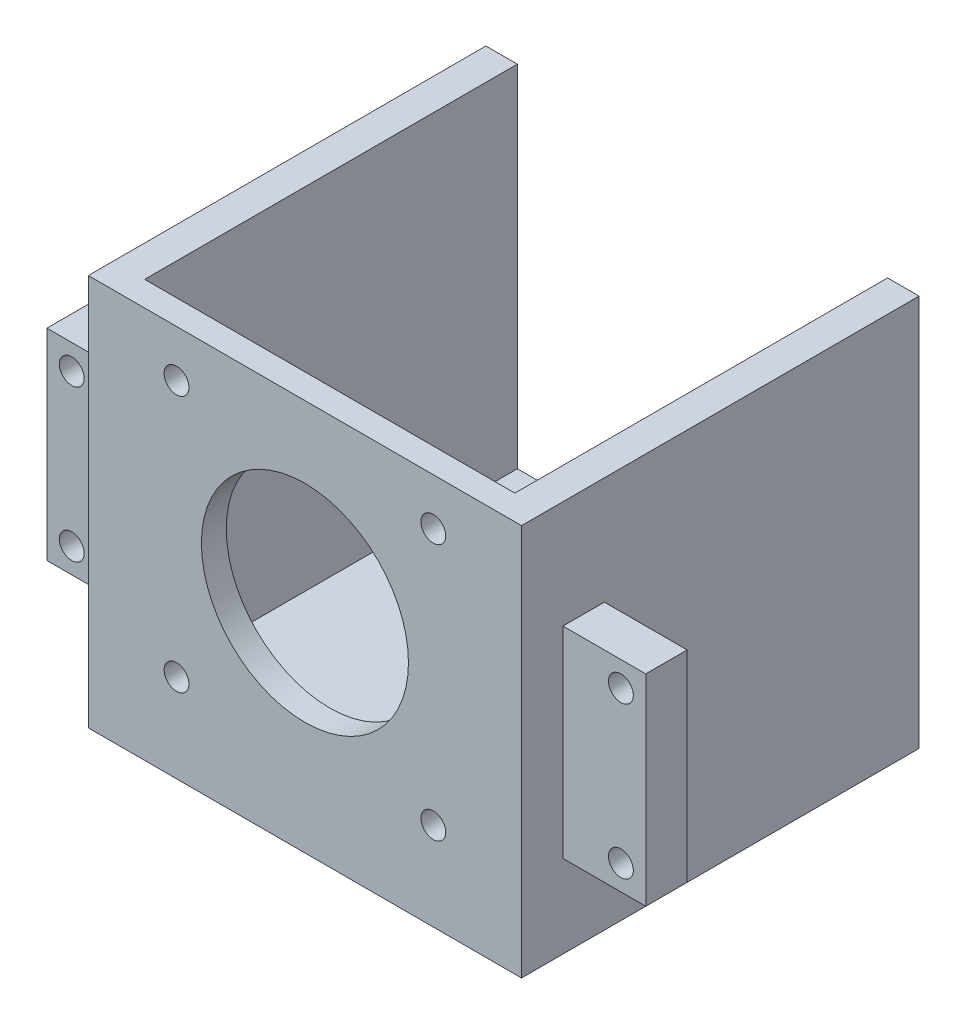
ISO-10303-21;
HEADER;
FILE_DESCRIPTION(('STEP AP214'),'2;1');
FILE_NAME('part.step','',(''),(''),'','','');
FILE_SCHEMA(('AUTOMOTIVE_DESIGN { 1 0 10303 214 1 1 1 1 }'));
ENDSEC;
DATA;
#1=APPLICATION_CONTEXT('core data for automotive mechanical design processes');
#2=APPLICATION_PROTOCOL_DEFINITION('international standard','automotive_design',2000,#1);
#3=PRODUCT_CONTEXT('',#1,'mechanical');
#4=PRODUCT('Part','Part','',(#3));
#5=PRODUCT_RELATED_PRODUCT_CATEGORY('part','',(#4));
#6=PRODUCT_DEFINITION_FORMATION('','',#4);
#7=PRODUCT_DEFINITION_CONTEXT('part definition',#1,'design');
#8=PRODUCT_DEFINITION('design','',#6,#7);
#9=PRODUCT_DEFINITION_SHAPE('','',#8);
#10=(LENGTH_UNIT() NAMED_UNIT(*) SI_UNIT(.MILLI.,.METRE.));
#11=(NAMED_UNIT(*) PLANE_ANGLE_UNIT() SI_UNIT($,.RADIAN.));
#12=(NAMED_UNIT(*) SI_UNIT($,.STERADIAN.) SOLID_ANGLE_UNIT());
#13=UNCERTAINTY_MEASURE_WITH_UNIT(LENGTH_MEASURE(1.E-05),#10,'distance_accuracy_value','');
#14=(GEOMETRIC_REPRESENTATION_CONTEXT(3) GLOBAL_UNCERTAINTY_ASSIGNED_CONTEXT((#13)) GLOBAL_UNIT_ASSIGNED_CONTEXT((#10,
#11,#12)) REPRESENTATION_CONTEXT('',''));
#15=CARTESIAN_POINT('',(0.,0.,0.));
#16=DIRECTION('',(0.,0.,1.));
#17=DIRECTION('',(1.,0.,0.));
#18=AXIS2_PLACEMENT_3D('',#15,#16,#17);
#19=CARTESIAN_POINT('',(-26.15,0.,-45.));
#20=DIRECTION('',(1.,0.,0.));
#21=DIRECTION('',(0.,0.,-1.));
#22=AXIS2_PLACEMENT_3D('',#19,#20,#21);
#23=PLANE('',#22);
#24=DIRECTION('',(0.,0.,1.));
#25=VECTOR('',#24,1.);
#26=CARTESIAN_POINT('',(-26.15,-16.15,-12.));
#27=LINE('',#26,#25);
#28=CARTESIAN_POINT('',(-26.15,-16.15,-7.));
#29=VERTEX_POINT('',#28);
#30=CARTESIAN_POINT('',(-26.15,-16.15,-2.));
#31=VERTEX_POINT('',#30);
#32=EDGE_CURVE('E179',#29,#31,#27,.T.);
#33=ORIENTED_EDGE('',*,*,#32,.F.);
#34=DIRECTION('',(0.,-1.,0.));
#35=VECTOR('',#34,1.);
#36=CARTESIAN_POINT('',(-26.15,-26.15,-7.));
#37=LINE('',#36,#35);
#38=CARTESIAN_POINT('',(-26.15,8.15,-7.));
#39=VERTEX_POINT('',#38);
#40=EDGE_CURVE('E208',#39,#29,#37,.T.);
#41=ORIENTED_EDGE('',*,*,#40,.F.);
#42=DIRECTION('',(0.,0.,1.));
#43=VECTOR('',#42,1.);
#44=CARTESIAN_POINT('',(-26.15,8.15,-12.));
#45=LINE('',#44,#43);
#46=CARTESIAN_POINT('',(-26.15,8.15,-2.));
#47=VERTEX_POINT('',#46);
#48=EDGE_CURVE('E400',#39,#47,#45,.T.);
#49=ORIENTED_EDGE('',*,*,#48,.T.);
#50=DIRECTION('',(0.,1.,0.));
#51=VECTOR('',#50,1.);
#52=CARTESIAN_POINT('',(-26.15,-26.15,-2.));
#53=LINE('',#52,#51);
#54=EDGE_CURVE('E203',#31,#47,#53,.T.);
#55=ORIENTED_EDGE('',*,*,#54,.F.);
#56=EDGE_LOOP('',(#33,#41,#49,#55));
#57=FACE_BOUND('',#56,.T.);
#58=DIRECTION('',(0.,0.,1.));
#59=VECTOR('',#58,1.);
#60=CARTESIAN_POINT('',(-26.15,-26.15,-45.));
#61=LINE('',#60,#59);
#62=CARTESIAN_POINT('',(-26.15,-26.15,-45.));
#63=VERTEX_POINT('',#62);
#64=CARTESIAN_POINT('',(-26.15,-26.15,3.));
#65=VERTEX_POINT('',#64);
#66=EDGE_CURVE('E252',#63,#65,#61,.T.);
#67=ORIENTED_EDGE('',*,*,#66,.T.);
#68=DIRECTION('',(0.,1.,0.));
#69=VECTOR('',#68,1.);
#70=CARTESIAN_POINT('',(-26.15,0.,3.));
#71=LINE('',#70,#69);
#72=CARTESIAN_POINT('',(-26.15,21.15,3.));
#73=VERTEX_POINT('',#72);
#74=EDGE_CURVE('E207',#65,#73,#71,.T.);
#75=ORIENTED_EDGE('',*,*,#74,.T.);
#76=DIRECTION('',(0.,0.,1.));
#77=VECTOR('',#76,1.);
#78=CARTESIAN_POINT('',(-26.15,21.15,-45.));
#79=LINE('',#78,#77);
#80=CARTESIAN_POINT('',(-26.15,21.15,-45.));
#81=VERTEX_POINT('',#80);
#82=EDGE_CURVE('E234',#81,#73,#79,.T.);
#83=ORIENTED_EDGE('',*,*,#82,.F.);
#84=DIRECTION('',(0.,1.,0.));
#85=VECTOR('',#84,1.);
#86=CARTESIAN_POINT('',(-26.15,0.,-45.));
#87=LINE('',#86,#85);
#88=EDGE_CURVE('E219',#63,#81,#87,.T.);
#89=ORIENTED_EDGE('',*,*,#88,.F.);
#90=EDGE_LOOP('',(#67,#75,#83,#89));
#91=FACE_BOUND('',#90,.T.);
#92=ADVANCED_FACE('F45',(#57,#91),#23,.F.);
#93=CARTESIAN_POINT('',(21.15,21.15,3.));
#94=DIRECTION('',(0.,-1.,0.));
#95=DIRECTION('',(1.,0.,0.));
#96=AXIS2_PLACEMENT_3D('',#93,#94,#95);
#97=PLANE('',#96);
#98=DIRECTION('',(-1.,0.,0.));
#99=VECTOR('',#98,1.);
#100=CARTESIAN_POINT('',(21.15,21.15,3.));
#101=LINE('',#100,#99);
#102=CARTESIAN_POINT('',(26.15,21.15,3.));
#103=VERTEX_POINT('',#102);
#104=EDGE_CURVE('E297',#103,#73,#101,.T.);
#105=ORIENTED_EDGE('',*,*,#104,.F.);
#106=DIRECTION('',(0.,0.,1.));
#107=VECTOR('',#106,1.);
#108=CARTESIAN_POINT('',(26.15,21.15,-45.));
#109=LINE('',#108,#107);
#110=CARTESIAN_POINT('',(26.15,21.15,-45.));
#111=VERTEX_POINT('',#110);
#112=EDGE_CURVE('E245',#111,#103,#109,.T.);
#113=ORIENTED_EDGE('',*,*,#112,.F.);
#114=DIRECTION('',(1.,0.,0.));
#115=VECTOR('',#114,1.);
#116=CARTESIAN_POINT('',(0.,21.15,-45.));
#117=LINE('',#116,#115);
#118=CARTESIAN_POINT('',(22.35,21.15,-45.));
#119=VERTEX_POINT('',#118);
#120=EDGE_CURVE('E221',#119,#111,#117,.T.);
#121=ORIENTED_EDGE('',*,*,#120,.F.);
#122=DIRECTION('',(0.,0.,-1.));
#123=VECTOR('',#122,1.);
#124=CARTESIAN_POINT('',(22.35,21.15,0.));
#125=LINE('',#124,#123);
#126=CARTESIAN_POINT('',(22.35,21.15,0.));
#127=VERTEX_POINT('',#126);
#128=EDGE_CURVE('E334',#127,#119,#125,.T.);
#129=ORIENTED_EDGE('',*,*,#128,.F.);
#130=DIRECTION('',(-1.,0.,0.));
#131=VECTOR('',#130,1.);
#132=CARTESIAN_POINT('',(21.15,21.15,0.));
#133=LINE('',#132,#131);
#134=CARTESIAN_POINT('',(-22.35,21.15,0.));
#135=VERTEX_POINT('',#134);
#136=EDGE_CURVE('E301',#127,#135,#133,.T.);
#137=ORIENTED_EDGE('',*,*,#136,.T.);
#138=DIRECTION('',(0.,0.,1.));
#139=VECTOR('',#138,1.);
#140=CARTESIAN_POINT('',(-22.35,21.15,-45.));
#141=LINE('',#140,#139);
#142=CARTESIAN_POINT('',(-22.35,21.15,-45.));
#143=VERTEX_POINT('',#142);
#144=EDGE_CURVE('E329',#143,#135,#141,.T.);
#145=ORIENTED_EDGE('',*,*,#144,.F.);
#146=EDGE_CURVE('E215',#81,#143,#117,.T.);
#147=ORIENTED_EDGE('',*,*,#146,.F.);
#148=ORIENTED_EDGE('',*,*,#82,.T.);
#149=EDGE_LOOP('',(#105,#113,#121,#129,#137,#145,#147,#148));
#150=FACE_BOUND('',#149,.T.);
#151=ADVANCED_FACE('F47',(#150),#97,.F.);
#152=CARTESIAN_POINT('',(0.,0.,3.));
#153=DIRECTION('',(0.,0.,1.));
#154=DIRECTION('',(1.,0.,0.));
#155=AXIS2_PLACEMENT_3D('',#152,#153,#154);
#156=PLANE('',#155);
#157=CARTESIAN_POINT('',(0.,0.,3.));
#158=DIRECTION('',(0.,0.,1.));
#159=DIRECTION('',(1.,0.,0.));
#160=AXIS2_PLACEMENT_3D('',#157,#158,#159);
#161=CIRCLE('',#160,12.5);
#162=CARTESIAN_POINT('',(12.5,0.,3.));
#163=VERTEX_POINT('',#162);
#164=EDGE_CURVE('E248',#163,#163,#161,.T.);
#165=ORIENTED_EDGE('',*,*,#164,.F.);
#166=EDGE_LOOP('',(#165));
#167=FACE_BOUND('',#166,.T.);
#168=CARTESIAN_POINT('',(-15.5000000000002,-15.4999999999998,3.));
#169=DIRECTION('',(0.,0.,1.));
#170=DIRECTION('',(1.,0.,0.));
#171=AXIS2_PLACEMENT_3D('',#168,#169,#170);
#172=CIRCLE('',#171,1.5);
#173=CARTESIAN_POINT('',(-14.0000000000002,-15.4999999999998,3.));
#174=VERTEX_POINT('',#173);
#175=EDGE_CURVE('E282',#174,#174,#172,.T.);
#176=ORIENTED_EDGE('',*,*,#175,.F.);
#177=EDGE_LOOP('',(#176));
#178=FACE_BOUND('',#177,.T.);
#179=CARTESIAN_POINT('',(15.4999999999999,-15.5000000000001,3.));
#180=DIRECTION('',(0.,0.,1.));
#181=DIRECTION('',(1.,0.,0.));
#182=AXIS2_PLACEMENT_3D('',#179,#180,#181);
#183=CIRCLE('',#182,1.5);
#184=CARTESIAN_POINT('',(16.9999999999999,-15.5000000000001,3.));
#185=VERTEX_POINT('',#184);
#186=EDGE_CURVE('E274',#185,#185,#183,.T.);
#187=ORIENTED_EDGE('',*,*,#186,.F.);
#188=EDGE_LOOP('',(#187));
#189=FACE_BOUND('',#188,.T.);
#190=CARTESIAN_POINT('',(15.5,15.4999999999999,3.));
#191=DIRECTION('',(0.,0.,1.));
#192=DIRECTION('',(1.,0.,0.));
#193=AXIS2_PLACEMENT_3D('',#190,#191,#192);
#194=CIRCLE('',#193,1.5);
#195=CARTESIAN_POINT('',(17.,15.4999999999999,3.));
#196=VERTEX_POINT('',#195);
#197=EDGE_CURVE('E265',#196,#196,#194,.T.);
#198=ORIENTED_EDGE('',*,*,#197,.F.);
#199=EDGE_LOOP('',(#198));
#200=FACE_BOUND('',#199,.T.);
#201=CARTESIAN_POINT('',(-15.5,15.5,3.));
#202=DIRECTION('',(0.,0.,1.));
#203=DIRECTION('',(1.,0.,0.));
#204=AXIS2_PLACEMENT_3D('',#201,#202,#203);
#205=CIRCLE('',#204,1.5);
#206=CARTESIAN_POINT('',(-14.,15.5,3.));
#207=VERTEX_POINT('',#206);
#208=EDGE_CURVE('E269',#207,#207,#205,.T.);
#209=ORIENTED_EDGE('',*,*,#208,.F.);
#210=EDGE_LOOP('',(#209));
#211=FACE_BOUND('',#210,.T.);
#212=ORIENTED_EDGE('',*,*,#104,.T.);
#213=ORIENTED_EDGE('',*,*,#74,.F.);
#214=DIRECTION('',(-1.,0.,0.));
#215=VECTOR('',#214,1.);
#216=CARTESIAN_POINT('',(0.,-26.15,3.));
#217=LINE('',#216,#215);
#218=CARTESIAN_POINT('',(26.15,-26.15,3.));
#219=VERTEX_POINT('',#218);
#220=EDGE_CURVE('E238',#219,#65,#217,.T.);
#221=ORIENTED_EDGE('',*,*,#220,.F.);
#222=DIRECTION('',(0.,1.,0.));
#223=VECTOR('',#222,1.);
#224=CARTESIAN_POINT('',(26.15,0.,3.));
#225=LINE('',#224,#223);
#226=EDGE_CURVE('E220',#219,#103,#225,.T.);
#227=ORIENTED_EDGE('',*,*,#226,.T.);
#228=EDGE_LOOP('',(#212,#213,#221,#227));
#229=FACE_BOUND('',#228,.T.);
#230=ADVANCED_FACE('F436',(#167,#178,#189,#200,#211,#229),#156,.T.);
#231=CARTESIAN_POINT('',(0.,0.,0.));
#232=DIRECTION('',(0.,0.,1.));
#233=DIRECTION('',(1.,0.,0.));
#234=AXIS2_PLACEMENT_3D('',#231,#232,#233);
#235=PLANE('',#234);
#236=CARTESIAN_POINT('',(0.,0.,0.));
#237=DIRECTION('',(0.,0.,1.));
#238=DIRECTION('',(1.,0.,0.));
#239=AXIS2_PLACEMENT_3D('',#236,#237,#238);
#240=CIRCLE('',#239,12.5);
#241=CARTESIAN_POINT('',(12.5,0.,0.));
#242=VERTEX_POINT('',#241);
#243=EDGE_CURVE('E257',#242,#242,#240,.T.);
#244=ORIENTED_EDGE('',*,*,#243,.T.);
#245=EDGE_LOOP('',(#244));
#246=FACE_BOUND('',#245,.T.);
#247=CARTESIAN_POINT('',(-15.5000000000002,-15.4999999999998,0.));
#248=DIRECTION('',(0.,0.,1.));
#249=DIRECTION('',(1.,0.,0.));
#250=AXIS2_PLACEMENT_3D('',#247,#248,#249);
#251=CIRCLE('',#250,1.5);
#252=CARTESIAN_POINT('',(-14.0000000000002,-15.4999999999998,0.));
#253=VERTEX_POINT('',#252);
#254=EDGE_CURVE('E261',#253,#253,#251,.T.);
#255=ORIENTED_EDGE('',*,*,#254,.T.);
#256=EDGE_LOOP('',(#255));
#257=FACE_BOUND('',#256,.T.);
#258=CARTESIAN_POINT('',(15.4999999999999,-15.5000000000001,0.));
#259=DIRECTION('',(0.,0.,1.));
#260=DIRECTION('',(1.,0.,0.));
#261=AXIS2_PLACEMENT_3D('',#258,#259,#260);
#262=CIRCLE('',#261,1.5);
#263=CARTESIAN_POINT('',(16.9999999999999,-15.5000000000001,0.));
#264=VERTEX_POINT('',#263);
#265=EDGE_CURVE('E278',#264,#264,#262,.T.);
#266=ORIENTED_EDGE('',*,*,#265,.T.);
#267=EDGE_LOOP('',(#266));
#268=FACE_BOUND('',#267,.T.);
#269=CARTESIAN_POINT('',(15.5,15.4999999999999,0.));
#270=DIRECTION('',(0.,0.,1.));
#271=DIRECTION('',(1.,0.,0.));
#272=AXIS2_PLACEMENT_3D('',#269,#270,#271);
#273=CIRCLE('',#272,1.5);
#274=CARTESIAN_POINT('',(17.,15.4999999999999,0.));
#275=VERTEX_POINT('',#274);
#276=EDGE_CURVE('E270',#275,#275,#273,.T.);
#277=ORIENTED_EDGE('',*,*,#276,.T.);
#278=EDGE_LOOP('',(#277));
#279=FACE_BOUND('',#278,.T.);
#280=CARTESIAN_POINT('',(-15.5,15.5,0.));
#281=DIRECTION('',(0.,0.,1.));
#282=DIRECTION('',(1.,0.,0.));
#283=AXIS2_PLACEMENT_3D('',#280,#281,#282);
#284=CIRCLE('',#283,1.5);
#285=CARTESIAN_POINT('',(-14.,15.5,0.));
#286=VERTEX_POINT('',#285);
#287=EDGE_CURVE('E289',#286,#286,#284,.T.);
#288=ORIENTED_EDGE('',*,*,#287,.T.);
#289=EDGE_LOOP('',(#288));
#290=FACE_BOUND('',#289,.T.);
#291=DIRECTION('',(1.,0.,0.));
#292=VECTOR('',#291,1.);
#293=CARTESIAN_POINT('',(21.15,-21.15,0.));
#294=LINE('',#293,#292);
#295=CARTESIAN_POINT('',(-22.35,-21.15,0.));
#296=VERTEX_POINT('',#295);
#297=CARTESIAN_POINT('',(22.35,-21.15,0.));
#298=VERTEX_POINT('',#297);
#299=EDGE_CURVE('E293',#296,#298,#294,.T.);
#300=ORIENTED_EDGE('',*,*,#299,.F.);
#301=DIRECTION('',(0.,1.,0.));
#302=VECTOR('',#301,1.);
#303=CARTESIAN_POINT('',(-22.35,-84.5778330072847,0.));
#304=LINE('',#303,#302);
#305=EDGE_CURVE('E346',#296,#135,#304,.T.);
#306=ORIENTED_EDGE('',*,*,#305,.T.);
#307=ORIENTED_EDGE('',*,*,#136,.F.);
#308=DIRECTION('',(0.,1.,0.));
#309=VECTOR('',#308,1.);
#310=CARTESIAN_POINT('',(22.35,-84.5778330072847,0.));
#311=LINE('',#310,#309);
#312=EDGE_CURVE('E352',#298,#127,#311,.T.);
#313=ORIENTED_EDGE('',*,*,#312,.F.);
#314=EDGE_LOOP('',(#300,#306,#307,#313));
#315=FACE_BOUND('',#314,.T.);
#316=ADVANCED_FACE('F463',(#246,#257,#268,#279,#290,#315),#235,.F.);
#317=CARTESIAN_POINT('',(-15.5,15.5,0.));
#318=DIRECTION('',(0.,0.,1.));
#319=DIRECTION('',(1.,0.,0.));
#320=AXIS2_PLACEMENT_3D('',#317,#318,#319);
#321=CYLINDRICAL_SURFACE('',#320,1.5);
#322=ORIENTED_EDGE('',*,*,#287,.F.);
#323=EDGE_LOOP('',(#322));
#324=FACE_BOUND('',#323,.T.);
#325=ORIENTED_EDGE('',*,*,#208,.T.);
#326=EDGE_LOOP('',(#325));
#327=FACE_BOUND('',#326,.T.);
#328=ADVANCED_FACE('F453',(#324,#327),#321,.F.);
#329=CARTESIAN_POINT('',(15.5,15.4999999999999,0.));
#330=DIRECTION('',(0.,0.,1.));
#331=DIRECTION('',(1.,0.,0.));
#332=AXIS2_PLACEMENT_3D('',#329,#330,#331);
#333=CYLINDRICAL_SURFACE('',#332,1.5);
#334=ORIENTED_EDGE('',*,*,#276,.F.);
#335=EDGE_LOOP('',(#334));
#336=FACE_BOUND('',#335,.T.);
#337=ORIENTED_EDGE('',*,*,#197,.T.);
#338=EDGE_LOOP('',(#337));
#339=FACE_BOUND('',#338,.T.);
#340=ADVANCED_FACE('F449',(#336,#339),#333,.F.);
#341=CARTESIAN_POINT('',(15.4999999999999,-15.5000000000001,0.));
#342=DIRECTION('',(0.,0.,1.));
#343=DIRECTION('',(1.,0.,0.));
#344=AXIS2_PLACEMENT_3D('',#341,#342,#343);
#345=CYLINDRICAL_SURFACE('',#344,1.5);
#346=ORIENTED_EDGE('',*,*,#265,.F.);
#347=EDGE_LOOP('',(#346));
#348=FACE_BOUND('',#347,.T.);
#349=ORIENTED_EDGE('',*,*,#186,.T.);
#350=EDGE_LOOP('',(#349));
#351=FACE_BOUND('',#350,.T.);
#352=ADVANCED_FACE('F452',(#348,#351),#345,.F.);
#353=CARTESIAN_POINT('',(-15.5000000000002,-15.4999999999998,0.));
#354=DIRECTION('',(0.,0.,1.));
#355=DIRECTION('',(1.,0.,0.));
#356=AXIS2_PLACEMENT_3D('',#353,#354,#355);
#357=CYLINDRICAL_SURFACE('',#356,1.5);
#358=ORIENTED_EDGE('',*,*,#254,.F.);
#359=EDGE_LOOP('',(#358));
#360=FACE_BOUND('',#359,.T.);
#361=ORIENTED_EDGE('',*,*,#175,.T.);
#362=EDGE_LOOP('',(#361));
#363=FACE_BOUND('',#362,.T.);
#364=ADVANCED_FACE('F447',(#360,#363),#357,.F.);
#365=CARTESIAN_POINT('',(0.,0.,0.));
#366=DIRECTION('',(0.,0.,1.));
#367=DIRECTION('',(1.,0.,0.));
#368=AXIS2_PLACEMENT_3D('',#365,#366,#367);
#369=CYLINDRICAL_SURFACE('',#368,12.5);
#370=ORIENTED_EDGE('',*,*,#243,.F.);
#371=EDGE_LOOP('',(#370));
#372=FACE_BOUND('',#371,.T.);
#373=ORIENTED_EDGE('',*,*,#164,.T.);
#374=EDGE_LOOP('',(#373));
#375=FACE_BOUND('',#374,.T.);
#376=ADVANCED_FACE('F443',(#372,#375),#369,.F.);
#377=CARTESIAN_POINT('',(0.,-21.15,-45.));
#378=DIRECTION('',(0.,-1.,0.));
#379=DIRECTION('',(1.,0.,0.));
#380=AXIS2_PLACEMENT_3D('',#377,#378,#379);
#381=PLANE('',#380);
#382=DIRECTION('',(1.,0.,0.));
#383=VECTOR('',#382,1.);
#384=CARTESIAN_POINT('',(0.,-21.15,-45.));
#385=LINE('',#384,#383);
#386=CARTESIAN_POINT('',(-22.35,-21.15,-45.));
#387=VERTEX_POINT('',#386);
#388=CARTESIAN_POINT('',(22.35,-21.15,-45.));
#389=VERTEX_POINT('',#388);
#390=EDGE_CURVE('E231',#387,#389,#385,.T.);
#391=ORIENTED_EDGE('',*,*,#390,.F.);
#392=DIRECTION('',(0.,0.,1.));
#393=VECTOR('',#392,1.);
#394=CARTESIAN_POINT('',(-22.35,-21.15,-45.));
#395=LINE('',#394,#393);
#396=EDGE_CURVE('E341',#387,#296,#395,.T.);
#397=ORIENTED_EDGE('',*,*,#396,.T.);
#398=ORIENTED_EDGE('',*,*,#299,.T.);
#399=DIRECTION('',(0.,0.,-1.));
#400=VECTOR('',#399,1.);
#401=CARTESIAN_POINT('',(22.35,-21.15,0.));
#402=LINE('',#401,#400);
#403=EDGE_CURVE('E347',#298,#389,#402,.T.);
#404=ORIENTED_EDGE('',*,*,#403,.T.);
#405=EDGE_LOOP('',(#391,#397,#398,#404));
#406=FACE_BOUND('',#405,.T.);
#407=ADVANCED_FACE('F446',(#406),#381,.F.);
#408=CARTESIAN_POINT('',(26.15,0.,-45.));
#409=DIRECTION('',(1.,0.,0.));
#410=DIRECTION('',(0.,0.,-1.));
#411=AXIS2_PLACEMENT_3D('',#408,#409,#410);
#412=PLANE('',#411);
#413=ORIENTED_EDGE('',*,*,#112,.T.);
#414=ORIENTED_EDGE('',*,*,#226,.F.);
#415=DIRECTION('',(0.,0.,1.));
#416=VECTOR('',#415,1.);
#417=CARTESIAN_POINT('',(26.15,-26.15,-45.));
#418=LINE('',#417,#416);
#419=CARTESIAN_POINT('',(26.15,-26.15,-45.));
#420=VERTEX_POINT('',#419);
#421=EDGE_CURVE('E249',#420,#219,#418,.T.);
#422=ORIENTED_EDGE('',*,*,#421,.F.);
#423=DIRECTION('',(0.,1.,0.));
#424=VECTOR('',#423,1.);
#425=CARTESIAN_POINT('',(26.15,0.,-45.));
#426=LINE('',#425,#424);
#427=EDGE_CURVE('E227',#420,#111,#426,.T.);
#428=ORIENTED_EDGE('',*,*,#427,.T.);
#429=EDGE_LOOP('',(#413,#414,#422,#428));
#430=FACE_BOUND('',#429,.T.);
#431=DIRECTION('',(0.,1.,0.));
#432=VECTOR('',#431,1.);
#433=CARTESIAN_POINT('',(26.15,-26.15,-7.));
#434=LINE('',#433,#432);
#435=CARTESIAN_POINT('',(26.15,-16.15,-7.));
#436=VERTEX_POINT('',#435);
#437=CARTESIAN_POINT('',(26.15,8.15,-7.));
#438=VERTEX_POINT('',#437);
#439=EDGE_CURVE('E165',#436,#438,#434,.T.);
#440=ORIENTED_EDGE('',*,*,#439,.F.);
#441=DIRECTION('',(0.,0.,1.));
#442=VECTOR('',#441,1.);
#443=CARTESIAN_POINT('',(26.15,-16.15,-12.));
#444=LINE('',#443,#442);
#445=CARTESIAN_POINT('',(26.15,-16.15,-2.));
#446=VERTEX_POINT('',#445);
#447=EDGE_CURVE('E158',#436,#446,#444,.T.);
#448=ORIENTED_EDGE('',*,*,#447,.T.);
#449=DIRECTION('',(0.,-1.,0.));
#450=VECTOR('',#449,1.);
#451=CARTESIAN_POINT('',(26.15,-26.15,-2.));
#452=LINE('',#451,#450);
#453=CARTESIAN_POINT('',(26.15,8.15,-2.));
#454=VERTEX_POINT('',#453);
#455=EDGE_CURVE('E163',#454,#446,#452,.T.);
#456=ORIENTED_EDGE('',*,*,#455,.F.);
#457=DIRECTION('',(0.,0.,1.));
#458=VECTOR('',#457,1.);
#459=CARTESIAN_POINT('',(26.15,8.15,-12.));
#460=LINE('',#459,#458);
#461=EDGE_CURVE('E410',#438,#454,#460,.T.);
#462=ORIENTED_EDGE('',*,*,#461,.F.);
#463=EDGE_LOOP('',(#440,#448,#456,#462));
#464=FACE_BOUND('',#463,.T.);
#465=ADVANCED_FACE('F160',(#430,#464),#412,.T.);
#466=CARTESIAN_POINT('',(0.,-26.15,-45.));
#467=DIRECTION('',(0.,1.,0.));
#468=DIRECTION('',(0.,0.,1.));
#469=AXIS2_PLACEMENT_3D('',#466,#467,#468);
#470=PLANE('',#469);
#471=ORIENTED_EDGE('',*,*,#220,.T.);
#472=ORIENTED_EDGE('',*,*,#66,.F.);
#473=DIRECTION('',(-1.,0.,0.));
#474=VECTOR('',#473,1.);
#475=CARTESIAN_POINT('',(0.,-26.15,-45.));
#476=LINE('',#475,#474);
#477=EDGE_CURVE('E224',#420,#63,#476,.T.);
#478=ORIENTED_EDGE('',*,*,#477,.F.);
#479=ORIENTED_EDGE('',*,*,#421,.T.);
#480=EDGE_LOOP('',(#471,#472,#478,#479));
#481=FACE_BOUND('',#480,.T.);
#482=ADVANCED_FACE('F441',(#481),#470,.F.);
#483=CARTESIAN_POINT('',(0.,0.,-45.));
#484=DIRECTION('',(0.,0.,1.));
#485=DIRECTION('',(1.,0.,0.));
#486=AXIS2_PLACEMENT_3D('',#483,#484,#485);
#487=PLANE('',#486);
#488=DIRECTION('',(0.,1.,0.));
#489=VECTOR('',#488,1.);
#490=CARTESIAN_POINT('',(-22.35,-84.5778330072847,-45.));
#491=LINE('',#490,#489);
#492=EDGE_CURVE('E356',#387,#143,#491,.T.);
#493=ORIENTED_EDGE('',*,*,#492,.F.);
#494=ORIENTED_EDGE('',*,*,#390,.T.);
#495=DIRECTION('',(0.,1.,0.));
#496=VECTOR('',#495,1.);
#497=CARTESIAN_POINT('',(22.35,-84.5778330072847,-45.));
#498=LINE('',#497,#496);
#499=EDGE_CURVE('E351',#389,#119,#498,.T.);
#500=ORIENTED_EDGE('',*,*,#499,.T.);
#501=ORIENTED_EDGE('',*,*,#120,.T.);
#502=ORIENTED_EDGE('',*,*,#427,.F.);
#503=ORIENTED_EDGE('',*,*,#477,.T.);
#504=ORIENTED_EDGE('',*,*,#88,.T.);
#505=ORIENTED_EDGE('',*,*,#146,.T.);
#506=EDGE_LOOP('',(#493,#494,#500,#501,#502,#503,#504,#505));
#507=FACE_BOUND('',#506,.T.);
#508=ADVANCED_FACE('F492',(#507),#487,.F.);
#509=CARTESIAN_POINT('',(-36.15,-26.15,-7.));
#510=DIRECTION('',(0.,0.,1.));
#511=DIRECTION('',(0.,-1.,0.));
#512=AXIS2_PLACEMENT_3D('',#509,#510,#511);
#513=PLANE('',#512);
#514=CARTESIAN_POINT('',(-33.15,5.14999999999999,-7.));
#515=DIRECTION('',(0.,0.,1.));
#516=DIRECTION('',(1.,0.,0.));
#517=AXIS2_PLACEMENT_3D('',#514,#515,#516);
#518=CIRCLE('',#517,1.5);
#519=CARTESIAN_POINT('',(-31.65,5.14999999999999,-7.));
#520=VERTEX_POINT('',#519);
#521=EDGE_CURVE('E370',#520,#520,#518,.T.);
#522=ORIENTED_EDGE('',*,*,#521,.T.);
#523=EDGE_LOOP('',(#522));
#524=FACE_BOUND('',#523,.T.);
#525=CARTESIAN_POINT('',(-33.15,-13.15,-7.));
#526=DIRECTION('',(0.,0.,1.));
#527=DIRECTION('',(1.,0.,0.));
#528=AXIS2_PLACEMENT_3D('',#525,#526,#527);
#529=CIRCLE('',#528,1.5);
#530=CARTESIAN_POINT('',(-31.65,-13.15,-7.));
#531=VERTEX_POINT('',#530);
#532=EDGE_CURVE('E374',#531,#531,#529,.T.);
#533=ORIENTED_EDGE('',*,*,#532,.T.);
#534=EDGE_LOOP('',(#533));
#535=FACE_BOUND('',#534,.T.);
#536=ORIENTED_EDGE('',*,*,#40,.T.);
#537=DIRECTION('',(-1.,0.,0.));
#538=VECTOR('',#537,1.);
#539=CARTESIAN_POINT('',(-36.15,-16.15,-7.));
#540=LINE('',#539,#538);
#541=CARTESIAN_POINT('',(-36.15,-16.15,-7.));
#542=VERTEX_POINT('',#541);
#543=EDGE_CURVE('E326',#29,#542,#540,.T.);
#544=ORIENTED_EDGE('',*,*,#543,.T.);
#545=DIRECTION('',(0.,-1.,0.));
#546=VECTOR('',#545,1.);
#547=CARTESIAN_POINT('',(-36.15,-26.15,-7.));
#548=LINE('',#547,#546);
#549=CARTESIAN_POINT('',(-36.15,8.15,-7.));
#550=VERTEX_POINT('',#549);
#551=EDGE_CURVE('E198',#550,#542,#548,.T.);
#552=ORIENTED_EDGE('',*,*,#551,.F.);
#553=DIRECTION('',(1.,0.,0.));
#554=VECTOR('',#553,1.);
#555=CARTESIAN_POINT('',(-36.15,8.15,-7.));
#556=LINE('',#555,#554);
#557=EDGE_CURVE('E68',#550,#39,#556,.T.);
#558=ORIENTED_EDGE('',*,*,#557,.T.);
#559=EDGE_LOOP('',(#536,#544,#552,#558));
#560=FACE_BOUND('',#559,.T.);
#561=ADVANCED_FACE('F324',(#524,#535,#560),#513,.F.);
#562=CARTESIAN_POINT('',(-36.15,-26.15,-2.));
#563=DIRECTION('',(0.,0.,-1.));
#564=DIRECTION('',(-1.,0.,0.));
#565=AXIS2_PLACEMENT_3D('',#562,#563,#564);
#566=PLANE('',#565);
#567=CARTESIAN_POINT('',(-33.15,5.14999999999999,-2.));
#568=DIRECTION('',(0.,0.,-1.));
#569=DIRECTION('',(-1.,0.,0.));
#570=AXIS2_PLACEMENT_3D('',#567,#568,#569);
#571=CIRCLE('',#570,1.5);
#572=CARTESIAN_POINT('',(-34.65,5.14999999999999,-2.));
#573=VERTEX_POINT('',#572);
#574=EDGE_CURVE('E185',#573,#573,#571,.T.);
#575=ORIENTED_EDGE('',*,*,#574,.T.);
#576=EDGE_LOOP('',(#575));
#577=FACE_BOUND('',#576,.T.);
#578=CARTESIAN_POINT('',(-33.15,-13.15,-2.));
#579=DIRECTION('',(0.,0.,-1.));
#580=DIRECTION('',(-1.,0.,0.));
#581=AXIS2_PLACEMENT_3D('',#578,#579,#580);
#582=CIRCLE('',#581,1.5);
#583=CARTESIAN_POINT('',(-34.65,-13.15,-2.));
#584=VERTEX_POINT('',#583);
#585=EDGE_CURVE('E192',#584,#584,#582,.T.);
#586=ORIENTED_EDGE('',*,*,#585,.T.);
#587=EDGE_LOOP('',(#586));
#588=FACE_BOUND('',#587,.T.);
#589=DIRECTION('',(0.,1.,0.));
#590=VECTOR('',#589,1.);
#591=CARTESIAN_POINT('',(-36.15,-26.15,-2.));
#592=LINE('',#591,#590);
#593=CARTESIAN_POINT('',(-36.15,-16.15,-2.));
#594=VERTEX_POINT('',#593);
#595=CARTESIAN_POINT('',(-36.15,8.15,-2.));
#596=VERTEX_POINT('',#595);
#597=EDGE_CURVE('E202',#594,#596,#592,.T.);
#598=ORIENTED_EDGE('',*,*,#597,.F.);
#599=DIRECTION('',(-1.,0.,0.));
#600=VECTOR('',#599,1.);
#601=CARTESIAN_POINT('',(-36.15,-16.15,-2.));
#602=LINE('',#601,#600);
#603=EDGE_CURVE('E61',#31,#594,#602,.T.);
#604=ORIENTED_EDGE('',*,*,#603,.F.);
#605=ORIENTED_EDGE('',*,*,#54,.T.);
#606=DIRECTION('',(1.,0.,0.));
#607=VECTOR('',#606,1.);
#608=CARTESIAN_POINT('',(-36.15,8.15,-2.));
#609=LINE('',#608,#607);
#610=EDGE_CURVE('E405',#596,#47,#609,.T.);
#611=ORIENTED_EDGE('',*,*,#610,.F.);
#612=EDGE_LOOP('',(#598,#604,#605,#611));
#613=FACE_BOUND('',#612,.T.);
#614=ADVANCED_FACE('F524',(#577,#588,#613),#566,.F.);
#615=CARTESIAN_POINT('',(-36.15,0.,0.));
#616=DIRECTION('',(1.,0.,0.));
#617=DIRECTION('',(0.,0.,-1.));
#618=AXIS2_PLACEMENT_3D('',#615,#616,#617);
#619=PLANE('',#618);
#620=ORIENTED_EDGE('',*,*,#551,.T.);
#621=DIRECTION('',(0.,0.,1.));
#622=VECTOR('',#621,1.);
#623=CARTESIAN_POINT('',(-36.15,-16.15,0.));
#624=LINE('',#623,#622);
#625=EDGE_CURVE('E11',#542,#594,#624,.T.);
#626=ORIENTED_EDGE('',*,*,#625,.T.);
#627=ORIENTED_EDGE('',*,*,#597,.T.);
#628=DIRECTION('',(0.,0.,-1.));
#629=VECTOR('',#628,1.);
#630=CARTESIAN_POINT('',(-36.15,8.15,0.));
#631=LINE('',#630,#629);
#632=EDGE_CURVE('E54',#596,#550,#631,.T.);
#633=ORIENTED_EDGE('',*,*,#632,.T.);
#634=EDGE_LOOP('',(#620,#626,#627,#633));
#635=FACE_BOUND('',#634,.T.);
#636=ADVANCED_FACE('F318',(#635),#619,.F.);
#637=CARTESIAN_POINT('',(36.15,-26.15,-2.));
#638=DIRECTION('',(0.,0.,-1.));
#639=DIRECTION('',(-1.,0.,0.));
#640=AXIS2_PLACEMENT_3D('',#637,#638,#639);
#641=PLANE('',#640);
#642=CARTESIAN_POINT('',(33.15,-13.15,-2.));
#643=DIRECTION('',(0.,0.,-1.));
#644=DIRECTION('',(-1.,0.,0.));
#645=AXIS2_PLACEMENT_3D('',#642,#643,#644);
#646=CIRCLE('',#645,1.5);
#647=CARTESIAN_POINT('',(31.65,-13.15,-2.));
#648=VERTEX_POINT('',#647);
#649=EDGE_CURVE('E308',#648,#648,#646,.T.);
#650=ORIENTED_EDGE('',*,*,#649,.T.);
#651=EDGE_LOOP('',(#650));
#652=FACE_BOUND('',#651,.T.);
#653=CARTESIAN_POINT('',(33.15,5.14999999999999,-2.));
#654=DIRECTION('',(0.,0.,-1.));
#655=DIRECTION('',(-1.,0.,0.));
#656=AXIS2_PLACEMENT_3D('',#653,#654,#655);
#657=CIRCLE('',#656,1.5);
#658=CARTESIAN_POINT('',(31.65,5.14999999999999,-2.));
#659=VERTEX_POINT('',#658);
#660=EDGE_CURVE('E381',#659,#659,#657,.T.);
#661=ORIENTED_EDGE('',*,*,#660,.T.);
#662=EDGE_LOOP('',(#661));
#663=FACE_BOUND('',#662,.T.);
#664=DIRECTION('',(0.,-1.,0.));
#665=VECTOR('',#664,1.);
#666=CARTESIAN_POINT('',(36.15,-26.15,-2.));
#667=LINE('',#666,#665);
#668=CARTESIAN_POINT('',(36.15,8.15,-2.));
#669=VERTEX_POINT('',#668);
#670=CARTESIAN_POINT('',(36.15,-16.15,-2.));
#671=VERTEX_POINT('',#670);
#672=EDGE_CURVE('E189',#669,#671,#667,.T.);
#673=ORIENTED_EDGE('',*,*,#672,.F.);
#674=DIRECTION('',(1.,0.,0.));
#675=VECTOR('',#674,1.);
#676=CARTESIAN_POINT('',(36.15,8.15,-2.));
#677=LINE('',#676,#675);
#678=EDGE_CURVE('E183',#454,#669,#677,.T.);
#679=ORIENTED_EDGE('',*,*,#678,.F.);
#680=ORIENTED_EDGE('',*,*,#455,.T.);
#681=DIRECTION('',(-1.,0.,0.));
#682=VECTOR('',#681,1.);
#683=CARTESIAN_POINT('',(36.15,-16.15,-2.));
#684=LINE('',#683,#682);
#685=EDGE_CURVE('E169',#671,#446,#684,.T.);
#686=ORIENTED_EDGE('',*,*,#685,.F.);
#687=EDGE_LOOP('',(#673,#679,#680,#686));
#688=FACE_BOUND('',#687,.T.);
#689=ADVANCED_FACE('F182',(#652,#663,#688),#641,.F.);
#690=CARTESIAN_POINT('',(36.15,-26.15,-7.));
#691=DIRECTION('',(0.,0.,1.));
#692=DIRECTION('',(1.,0.,0.));
#693=AXIS2_PLACEMENT_3D('',#690,#691,#692);
#694=PLANE('',#693);
#695=CARTESIAN_POINT('',(33.15,-13.15,-7.));
#696=DIRECTION('',(0.,0.,1.));
#697=DIRECTION('',(-1.,0.,0.));
#698=AXIS2_PLACEMENT_3D('',#695,#696,#697);
#699=CIRCLE('',#698,1.5);
#700=CARTESIAN_POINT('',(31.65,-13.15,-7.));
#701=VERTEX_POINT('',#700);
#702=EDGE_CURVE('E369',#701,#701,#699,.T.);
#703=ORIENTED_EDGE('',*,*,#702,.T.);
#704=EDGE_LOOP('',(#703));
#705=FACE_BOUND('',#704,.T.);
#706=CARTESIAN_POINT('',(33.15,5.14999999999999,-7.));
#707=DIRECTION('',(0.,0.,1.));
#708=DIRECTION('',(-1.,0.,0.));
#709=AXIS2_PLACEMENT_3D('',#706,#707,#708);
#710=CIRCLE('',#709,1.5);
#711=CARTESIAN_POINT('',(31.65,5.14999999999999,-7.));
#712=VERTEX_POINT('',#711);
#713=EDGE_CURVE('E365',#712,#712,#710,.T.);
#714=ORIENTED_EDGE('',*,*,#713,.T.);
#715=EDGE_LOOP('',(#714));
#716=FACE_BOUND('',#715,.T.);
#717=ORIENTED_EDGE('',*,*,#439,.T.);
#718=DIRECTION('',(1.,0.,0.));
#719=VECTOR('',#718,1.);
#720=CARTESIAN_POINT('',(36.15,8.15,-7.));
#721=LINE('',#720,#719);
#722=CARTESIAN_POINT('',(36.15,8.15,-7.));
#723=VERTEX_POINT('',#722);
#724=EDGE_CURVE('E336',#438,#723,#721,.T.);
#725=ORIENTED_EDGE('',*,*,#724,.T.);
#726=DIRECTION('',(0.,1.,0.));
#727=VECTOR('',#726,1.);
#728=CARTESIAN_POINT('',(36.15,-26.15,-7.));
#729=LINE('',#728,#727);
#730=CARTESIAN_POINT('',(36.15,-16.15,-7.));
#731=VERTEX_POINT('',#730);
#732=EDGE_CURVE('E195',#731,#723,#729,.T.);
#733=ORIENTED_EDGE('',*,*,#732,.F.);
#734=DIRECTION('',(-1.,0.,0.));
#735=VECTOR('',#734,1.);
#736=CARTESIAN_POINT('',(36.15,-16.15,-7.));
#737=LINE('',#736,#735);
#738=EDGE_CURVE('E396',#731,#436,#737,.T.);
#739=ORIENTED_EDGE('',*,*,#738,.T.);
#740=EDGE_LOOP('',(#717,#725,#733,#739));
#741=FACE_BOUND('',#740,.T.);
#742=ADVANCED_FACE('F395',(#705,#716,#741),#694,.F.);
#743=CARTESIAN_POINT('',(36.15,0.,0.));
#744=DIRECTION('',(-1.,0.,0.));
#745=DIRECTION('',(0.,0.,1.));
#746=AXIS2_PLACEMENT_3D('',#743,#744,#745);
#747=PLANE('',#746);
#748=ORIENTED_EDGE('',*,*,#732,.T.);
#749=DIRECTION('',(0.,0.,1.));
#750=VECTOR('',#749,1.);
#751=CARTESIAN_POINT('',(36.15,8.15,0.));
#752=LINE('',#751,#750);
#753=EDGE_CURVE('E312',#723,#669,#752,.T.);
#754=ORIENTED_EDGE('',*,*,#753,.T.);
#755=ORIENTED_EDGE('',*,*,#672,.T.);
#756=DIRECTION('',(0.,0.,-1.));
#757=VECTOR('',#756,1.);
#758=CARTESIAN_POINT('',(36.15,-16.15,0.));
#759=LINE('',#758,#757);
#760=EDGE_CURVE('E174',#671,#731,#759,.T.);
#761=ORIENTED_EDGE('',*,*,#760,.T.);
#762=EDGE_LOOP('',(#748,#754,#755,#761));
#763=FACE_BOUND('',#762,.T.);
#764=ADVANCED_FACE('F392',(#763),#747,.F.);
#765=CARTESIAN_POINT('',(33.15,5.14999999999999,-7.));
#766=DIRECTION('',(0.,0.,1.));
#767=DIRECTION('',(1.,0.,0.));
#768=AXIS2_PLACEMENT_3D('',#765,#766,#767);
#769=CYLINDRICAL_SURFACE('',#768,1.5);
#770=ORIENTED_EDGE('',*,*,#713,.F.);
#771=EDGE_LOOP('',(#770));
#772=FACE_BOUND('',#771,.T.);
#773=ORIENTED_EDGE('',*,*,#660,.F.);
#774=EDGE_LOOP('',(#773));
#775=FACE_BOUND('',#774,.T.);
#776=ADVANCED_FACE('F539',(#772,#775),#769,.F.);
#777=CARTESIAN_POINT('',(33.15,-13.15,-7.));
#778=DIRECTION('',(0.,0.,1.));
#779=DIRECTION('',(1.,0.,0.));
#780=AXIS2_PLACEMENT_3D('',#777,#778,#779);
#781=CYLINDRICAL_SURFACE('',#780,1.5);
#782=ORIENTED_EDGE('',*,*,#702,.F.);
#783=EDGE_LOOP('',(#782));
#784=FACE_BOUND('',#783,.T.);
#785=ORIENTED_EDGE('',*,*,#649,.F.);
#786=EDGE_LOOP('',(#785));
#787=FACE_BOUND('',#786,.T.);
#788=ADVANCED_FACE('F544',(#784,#787),#781,.F.);
#789=CARTESIAN_POINT('',(-33.15,-13.15,-7.));
#790=DIRECTION('',(0.,0.,1.));
#791=DIRECTION('',(1.,0.,0.));
#792=AXIS2_PLACEMENT_3D('',#789,#790,#791);
#793=CYLINDRICAL_SURFACE('',#792,1.5);
#794=ORIENTED_EDGE('',*,*,#532,.F.);
#795=EDGE_LOOP('',(#794));
#796=FACE_BOUND('',#795,.T.);
#797=ORIENTED_EDGE('',*,*,#585,.F.);
#798=EDGE_LOOP('',(#797));
#799=FACE_BOUND('',#798,.T.);
#800=ADVANCED_FACE('F540',(#796,#799),#793,.F.);
#801=CARTESIAN_POINT('',(-33.15,5.14999999999999,-7.));
#802=DIRECTION('',(0.,0.,1.));
#803=DIRECTION('',(1.,0.,0.));
#804=AXIS2_PLACEMENT_3D('',#801,#802,#803);
#805=CYLINDRICAL_SURFACE('',#804,1.5);
#806=ORIENTED_EDGE('',*,*,#521,.F.);
#807=EDGE_LOOP('',(#806));
#808=FACE_BOUND('',#807,.T.);
#809=ORIENTED_EDGE('',*,*,#574,.F.);
#810=EDGE_LOOP('',(#809));
#811=FACE_BOUND('',#810,.T.);
#812=ADVANCED_FACE('F543',(#808,#811),#805,.F.);
#813=CARTESIAN_POINT('',(22.35,-84.5778330072847,0.));
#814=DIRECTION('',(1.,0.,0.));
#815=DIRECTION('',(0.,1.,0.));
#816=AXIS2_PLACEMENT_3D('',#813,#814,#815);
#817=PLANE('',#816);
#818=ORIENTED_EDGE('',*,*,#312,.T.);
#819=ORIENTED_EDGE('',*,*,#128,.T.);
#820=ORIENTED_EDGE('',*,*,#499,.F.);
#821=ORIENTED_EDGE('',*,*,#403,.F.);
#822=EDGE_LOOP('',(#818,#819,#820,#821));
#823=FACE_BOUND('',#822,.T.);
#824=ADVANCED_FACE('F495',(#823),#817,.F.);
#825=CARTESIAN_POINT('',(-22.35,-84.5778330072847,-45.));
#826=DIRECTION('',(-1.,0.,0.));
#827=DIRECTION('',(0.,-1.,0.));
#828=AXIS2_PLACEMENT_3D('',#825,#826,#827);
#829=PLANE('',#828);
#830=ORIENTED_EDGE('',*,*,#492,.T.);
#831=ORIENTED_EDGE('',*,*,#144,.T.);
#832=ORIENTED_EDGE('',*,*,#305,.F.);
#833=ORIENTED_EDGE('',*,*,#396,.F.);
#834=EDGE_LOOP('',(#830,#831,#832,#833));
#835=FACE_BOUND('',#834,.T.);
#836=ADVANCED_FACE('F426',(#835),#829,.F.);
#837=CARTESIAN_POINT('',(36.15,-16.15,-12.));
#838=DIRECTION('',(0.,1.,0.));
#839=DIRECTION('',(0.,0.,1.));
#840=AXIS2_PLACEMENT_3D('',#837,#838,#839);
#841=PLANE('',#840);
#842=ORIENTED_EDGE('',*,*,#760,.F.);
#843=ORIENTED_EDGE('',*,*,#685,.T.);
#844=ORIENTED_EDGE('',*,*,#447,.F.);
#845=ORIENTED_EDGE('',*,*,#738,.F.);
#846=EDGE_LOOP('',(#842,#843,#844,#845));
#847=FACE_BOUND('',#846,.T.);
#848=ADVANCED_FACE('F172',(#847),#841,.F.);
#849=CARTESIAN_POINT('',(36.15,8.15,-12.));
#850=DIRECTION('',(0.,-1.,0.));
#851=DIRECTION('',(0.,0.,-1.));
#852=AXIS2_PLACEMENT_3D('',#849,#850,#851);
#853=PLANE('',#852);
#854=ORIENTED_EDGE('',*,*,#461,.T.);
#855=ORIENTED_EDGE('',*,*,#678,.T.);
#856=ORIENTED_EDGE('',*,*,#753,.F.);
#857=ORIENTED_EDGE('',*,*,#724,.F.);
#858=EDGE_LOOP('',(#854,#855,#856,#857));
#859=FACE_BOUND('',#858,.T.);
#860=ADVANCED_FACE('F416',(#859),#853,.F.);
#861=CARTESIAN_POINT('',(-36.15,8.15,-12.));
#862=DIRECTION('',(0.,-1.,0.));
#863=DIRECTION('',(1.,0.,0.));
#864=AXIS2_PLACEMENT_3D('',#861,#862,#863);
#865=PLANE('',#864);
#866=ORIENTED_EDGE('',*,*,#632,.F.);
#867=ORIENTED_EDGE('',*,*,#610,.T.);
#868=ORIENTED_EDGE('',*,*,#48,.F.);
#869=ORIENTED_EDGE('',*,*,#557,.F.);
#870=EDGE_LOOP('',(#866,#867,#868,#869));
#871=FACE_BOUND('',#870,.T.);
#872=ADVANCED_FACE('F418',(#871),#865,.F.);
#873=CARTESIAN_POINT('',(-36.15,-16.15,-12.));
#874=DIRECTION('',(0.,1.,0.));
#875=DIRECTION('',(0.,0.,1.));
#876=AXIS2_PLACEMENT_3D('',#873,#874,#875);
#877=PLANE('',#876);
#878=ORIENTED_EDGE('',*,*,#32,.T.);
#879=ORIENTED_EDGE('',*,*,#603,.T.);
#880=ORIENTED_EDGE('',*,*,#625,.F.);
#881=ORIENTED_EDGE('',*,*,#543,.F.);
#882=EDGE_LOOP('',(#878,#879,#880,#881));
#883=FACE_BOUND('',#882,.T.);
#884=ADVANCED_FACE('F424',(#883),#877,.F.);
#885=CLOSED_SHELL('',(#92,#151,#230,#316,#328,#340,#352,#364,#376,#407,#465,#482,#508,#561,#614,
#636,#689,#742,#764,#776,#788,#800,#812,#824,#836,#848,#860,#872,#884));
#886=MANIFOLD_SOLID_BREP('B2',#885);
#887=ADVANCED_BREP_SHAPE_REPRESENTATION('',(#18,#886),#14);
#888=SHAPE_DEFINITION_REPRESENTATION(#9,#887);
ENDSEC;
END-ISO-10303-21;
